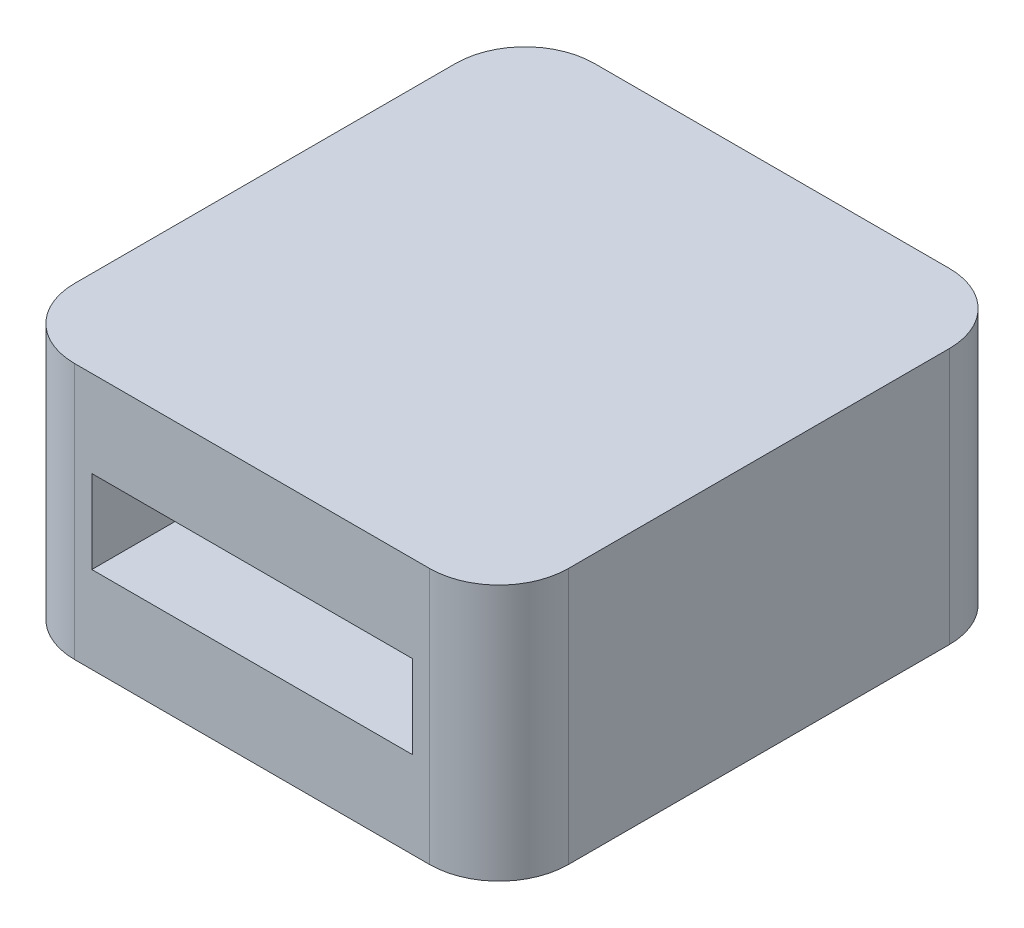
ISO-10303-21;
HEADER;
FILE_DESCRIPTION(('STEP AP214'),'2;1');
FILE_NAME('part.step','',(''),(''),'','','');
FILE_SCHEMA(('AUTOMOTIVE_DESIGN { 1 0 10303 214 1 1 1 1 }'));
ENDSEC;
DATA;
#1=APPLICATION_CONTEXT('core data for automotive mechanical design processes');
#2=APPLICATION_PROTOCOL_DEFINITION('international standard','automotive_design',2000,#1);
#3=PRODUCT_CONTEXT('',#1,'mechanical');
#4=PRODUCT('Part','Part','',(#3));
#5=PRODUCT_RELATED_PRODUCT_CATEGORY('part','',(#4));
#6=PRODUCT_DEFINITION_FORMATION('','',#4);
#7=PRODUCT_DEFINITION_CONTEXT('part definition',#1,'design');
#8=PRODUCT_DEFINITION('design','',#6,#7);
#9=PRODUCT_DEFINITION_SHAPE('','',#8);
#10=(LENGTH_UNIT() NAMED_UNIT(*) SI_UNIT(.MILLI.,.METRE.));
#11=(NAMED_UNIT(*) PLANE_ANGLE_UNIT() SI_UNIT($,.RADIAN.));
#12=(NAMED_UNIT(*) SI_UNIT($,.STERADIAN.) SOLID_ANGLE_UNIT());
#13=UNCERTAINTY_MEASURE_WITH_UNIT(LENGTH_MEASURE(1.E-05),#10,'distance_accuracy_value','');
#14=(GEOMETRIC_REPRESENTATION_CONTEXT(3) GLOBAL_UNCERTAINTY_ASSIGNED_CONTEXT((#13)) GLOBAL_UNIT_ASSIGNED_CONTEXT((#10,
#11,#12)) REPRESENTATION_CONTEXT('',''));
#15=CARTESIAN_POINT('',(0.,0.,0.));
#16=DIRECTION('',(0.,0.,1.));
#17=DIRECTION('',(1.,0.,0.));
#18=AXIS2_PLACEMENT_3D('',#15,#16,#17);
#19=CARTESIAN_POINT('',(0.,0.,15.));
#20=DIRECTION('',(0.,0.,-1.));
#21=DIRECTION('',(-1.,0.,0.));
#22=AXIS2_PLACEMENT_3D('',#19,#20,#21);
#23=PLANE('',#22);
#24=DIRECTION('',(1.,0.,0.));
#25=VECTOR('',#24,1.);
#26=CARTESIAN_POINT('',(-7.125,-3.7,15.));
#27=LINE('',#26,#25);
#28=CARTESIAN_POINT('',(-5.125,-3.7,15.));
#29=VERTEX_POINT('',#28);
#30=CARTESIAN_POINT('',(5.125,-3.7,15.));
#31=VERTEX_POINT('',#30);
#32=EDGE_CURVE('E191',#29,#31,#27,.T.);
#33=ORIENTED_EDGE('',*,*,#32,.T.);
#34=DIRECTION('',(0.,1.,0.));
#35=VECTOR('',#34,1.);
#36=CARTESIAN_POINT('',(5.125,0.,15.));
#37=LINE('',#36,#35);
#38=CARTESIAN_POINT('',(5.125,3.7,15.));
#39=VERTEX_POINT('',#38);
#40=EDGE_CURVE('E11',#31,#39,#37,.T.);
#41=ORIENTED_EDGE('',*,*,#40,.T.);
#42=DIRECTION('',(-1.,0.,0.));
#43=VECTOR('',#42,1.);
#44=CARTESIAN_POINT('',(-7.125,3.7,15.));
#45=LINE('',#44,#43);
#46=CARTESIAN_POINT('',(-5.125,3.7,15.));
#47=VERTEX_POINT('',#46);
#48=EDGE_CURVE('E187',#39,#47,#45,.T.);
#49=ORIENTED_EDGE('',*,*,#48,.T.);
#50=DIRECTION('',(0.,-1.,0.));
#51=VECTOR('',#50,1.);
#52=CARTESIAN_POINT('',(-5.125,0.,15.));
#53=LINE('',#52,#51);
#54=EDGE_CURVE('E49',#47,#29,#53,.T.);
#55=ORIENTED_EDGE('',*,*,#54,.T.);
#56=EDGE_LOOP('',(#33,#41,#49,#55));
#57=FACE_BOUND('',#56,.T.);
#58=DIRECTION('',(0.,1.,0.));
#59=VECTOR('',#58,1.);
#60=CARTESIAN_POINT('',(4.625,-1.2,15.));
#61=LINE('',#60,#59);
#62=CARTESIAN_POINT('',(4.625,-1.2,15.));
#63=VERTEX_POINT('',#62);
#64=CARTESIAN_POINT('',(4.625,1.2,15.));
#65=VERTEX_POINT('',#64);
#66=EDGE_CURVE('E133',#63,#65,#61,.T.);
#67=ORIENTED_EDGE('',*,*,#66,.F.);
#68=DIRECTION('',(1.,0.,0.));
#69=VECTOR('',#68,1.);
#70=CARTESIAN_POINT('',(-4.625,-1.2,15.));
#71=LINE('',#70,#69);
#72=CARTESIAN_POINT('',(-4.625,-1.2,15.));
#73=VERTEX_POINT('',#72);
#74=EDGE_CURVE('E163',#73,#63,#71,.T.);
#75=ORIENTED_EDGE('',*,*,#74,.F.);
#76=DIRECTION('',(0.,-1.,0.));
#77=VECTOR('',#76,1.);
#78=CARTESIAN_POINT('',(-4.625,-1.2,15.));
#79=LINE('',#78,#77);
#80=CARTESIAN_POINT('',(-4.625,1.2,15.));
#81=VERTEX_POINT('',#80);
#82=EDGE_CURVE('E158',#81,#73,#79,.T.);
#83=ORIENTED_EDGE('',*,*,#82,.F.);
#84=DIRECTION('',(-1.,0.,0.));
#85=VECTOR('',#84,1.);
#86=CARTESIAN_POINT('',(-4.625,1.2,15.));
#87=LINE('',#86,#85);
#88=EDGE_CURVE('E144',#65,#81,#87,.T.);
#89=ORIENTED_EDGE('',*,*,#88,.F.);
#90=EDGE_LOOP('',(#67,#75,#83,#89));
#91=FACE_BOUND('',#90,.T.);
#92=ADVANCED_FACE('F40',(#57,#91),#23,.F.);
#93=CARTESIAN_POINT('',(0.,0.,0.));
#94=DIRECTION('',(0.,0.,-1.));
#95=DIRECTION('',(-1.,0.,0.));
#96=AXIS2_PLACEMENT_3D('',#93,#94,#95);
#97=PLANE('',#96);
#98=DIRECTION('',(1.,0.,0.));
#99=VECTOR('',#98,1.);
#100=CARTESIAN_POINT('',(-7.125,-3.7,0.));
#101=LINE('',#100,#99);
#102=CARTESIAN_POINT('',(-5.125,-3.7,0.));
#103=VERTEX_POINT('',#102);
#104=CARTESIAN_POINT('',(5.125,-3.7,0.));
#105=VERTEX_POINT('',#104);
#106=EDGE_CURVE('E192',#103,#105,#101,.T.);
#107=ORIENTED_EDGE('',*,*,#106,.F.);
#108=DIRECTION('',(0.,-1.,0.));
#109=VECTOR('',#108,1.);
#110=CARTESIAN_POINT('',(-5.125,3.7,0.));
#111=LINE('',#110,#109);
#112=CARTESIAN_POINT('',(-5.125,3.7,0.));
#113=VERTEX_POINT('',#112);
#114=EDGE_CURVE('E239',#103,#113,#111,.F.);
#115=ORIENTED_EDGE('',*,*,#114,.T.);
#116=DIRECTION('',(-1.,0.,0.));
#117=VECTOR('',#116,1.);
#118=CARTESIAN_POINT('',(-7.125,3.7,0.));
#119=LINE('',#118,#117);
#120=CARTESIAN_POINT('',(5.125,3.7,0.));
#121=VERTEX_POINT('',#120);
#122=EDGE_CURVE('E153',#121,#113,#119,.T.);
#123=ORIENTED_EDGE('',*,*,#122,.F.);
#124=DIRECTION('',(0.,1.,0.));
#125=VECTOR('',#124,1.);
#126=CARTESIAN_POINT('',(5.125,-3.7,0.));
#127=LINE('',#126,#125);
#128=EDGE_CURVE('E236',#121,#105,#127,.F.);
#129=ORIENTED_EDGE('',*,*,#128,.T.);
#130=EDGE_LOOP('',(#107,#115,#123,#129));
#131=FACE_BOUND('',#130,.T.);
#132=DIRECTION('',(1.,0.,0.));
#133=VECTOR('',#132,1.);
#134=CARTESIAN_POINT('',(-4.625,-1.2,0.));
#135=LINE('',#134,#133);
#136=CARTESIAN_POINT('',(-4.625,-1.2,0.));
#137=VERTEX_POINT('',#136);
#138=CARTESIAN_POINT('',(4.625,-1.2,0.));
#139=VERTEX_POINT('',#138);
#140=EDGE_CURVE('E145',#137,#139,#135,.T.);
#141=ORIENTED_EDGE('',*,*,#140,.T.);
#142=DIRECTION('',(0.,1.,0.));
#143=VECTOR('',#142,1.);
#144=CARTESIAN_POINT('',(4.625,-1.2,0.));
#145=LINE('',#144,#143);
#146=CARTESIAN_POINT('',(4.625,1.2,0.));
#147=VERTEX_POINT('',#146);
#148=EDGE_CURVE('E168',#139,#147,#145,.T.);
#149=ORIENTED_EDGE('',*,*,#148,.T.);
#150=DIRECTION('',(-1.,0.,0.));
#151=VECTOR('',#150,1.);
#152=CARTESIAN_POINT('',(-4.625,1.2,0.));
#153=LINE('',#152,#151);
#154=CARTESIAN_POINT('',(-4.625,1.2,0.));
#155=VERTEX_POINT('',#154);
#156=EDGE_CURVE('E151',#147,#155,#153,.T.);
#157=ORIENTED_EDGE('',*,*,#156,.T.);
#158=DIRECTION('',(0.,-1.,0.));
#159=VECTOR('',#158,1.);
#160=CARTESIAN_POINT('',(-4.625,-1.2,0.));
#161=LINE('',#160,#159);
#162=EDGE_CURVE('E173',#155,#137,#161,.T.);
#163=ORIENTED_EDGE('',*,*,#162,.T.);
#164=EDGE_LOOP('',(#141,#149,#157,#163));
#165=FACE_BOUND('',#164,.T.);
#166=ADVANCED_FACE('F285',(#131,#165),#97,.T.);
#167=CARTESIAN_POINT('',(7.125,-3.7,15.));
#168=DIRECTION('',(-1.,0.,0.));
#169=DIRECTION('',(0.,-1.,0.));
#170=AXIS2_PLACEMENT_3D('',#167,#168,#169);
#171=PLANE('',#170);
#172=DIRECTION('',(0.,0.,-1.));
#173=VECTOR('',#172,1.);
#174=CARTESIAN_POINT('',(7.125,-3.7,15.));
#175=LINE('',#174,#173);
#176=CARTESIAN_POINT('',(7.125,-3.7,13.));
#177=VERTEX_POINT('',#176);
#178=CARTESIAN_POINT('',(7.125,-3.7,2.));
#179=VERTEX_POINT('',#178);
#180=EDGE_CURVE('E196',#177,#179,#175,.T.);
#181=ORIENTED_EDGE('',*,*,#180,.T.);
#182=DIRECTION('',(0.,1.,0.));
#183=VECTOR('',#182,1.);
#184=CARTESIAN_POINT('',(7.125,3.7,2.));
#185=LINE('',#184,#183);
#186=CARTESIAN_POINT('',(7.125,3.7,2.));
#187=VERTEX_POINT('',#186);
#188=EDGE_CURVE('E255',#179,#187,#185,.T.);
#189=ORIENTED_EDGE('',*,*,#188,.T.);
#190=DIRECTION('',(0.,0.,-1.));
#191=VECTOR('',#190,1.);
#192=CARTESIAN_POINT('',(7.125,3.7,15.));
#193=LINE('',#192,#191);
#194=CARTESIAN_POINT('',(7.125,3.7,13.));
#195=VERTEX_POINT('',#194);
#196=EDGE_CURVE('E214',#195,#187,#193,.T.);
#197=ORIENTED_EDGE('',*,*,#196,.F.);
#198=DIRECTION('',(0.,1.,0.));
#199=VECTOR('',#198,1.);
#200=CARTESIAN_POINT('',(7.125,-3.7,13.));
#201=LINE('',#200,#199);
#202=EDGE_CURVE('E252',#195,#177,#201,.F.);
#203=ORIENTED_EDGE('',*,*,#202,.T.);
#204=EDGE_LOOP('',(#181,#189,#197,#203));
#205=FACE_BOUND('',#204,.T.);
#206=ADVANCED_FACE('F292',(#205),#171,.F.);
#207=CARTESIAN_POINT('',(-7.125,3.7,15.));
#208=DIRECTION('',(0.,-1.,0.));
#209=DIRECTION('',(0.,0.,-1.));
#210=AXIS2_PLACEMENT_3D('',#207,#208,#209);
#211=PLANE('',#210);
#212=ORIENTED_EDGE('',*,*,#122,.T.);
#213=CARTESIAN_POINT('',(-5.125,3.7,2.));
#214=DIRECTION('',(0.,-1.,0.));
#215=DIRECTION('',(0.,0.,-1.));
#216=AXIS2_PLACEMENT_3D('',#213,#214,#215);
#217=CIRCLE('',#216,2.);
#218=CARTESIAN_POINT('',(-7.125,3.7,2.));
#219=VERTEX_POINT('',#218);
#220=EDGE_CURVE('E249',#113,#219,#217,.F.);
#221=ORIENTED_EDGE('',*,*,#220,.T.);
#222=DIRECTION('',(0.,0.,-1.));
#223=VECTOR('',#222,1.);
#224=CARTESIAN_POINT('',(-7.125,3.7,15.));
#225=LINE('',#224,#223);
#226=CARTESIAN_POINT('',(-7.125,3.7,13.));
#227=VERTEX_POINT('',#226);
#228=EDGE_CURVE('E210',#227,#219,#225,.T.);
#229=ORIENTED_EDGE('',*,*,#228,.F.);
#230=CARTESIAN_POINT('',(-5.125,3.7,13.));
#231=DIRECTION('',(0.,-1.,0.));
#232=DIRECTION('',(0.,0.,-1.));
#233=AXIS2_PLACEMENT_3D('',#230,#231,#232);
#234=CIRCLE('',#233,2.);
#235=EDGE_CURVE('E242',#227,#47,#234,.F.);
#236=ORIENTED_EDGE('',*,*,#235,.T.);
#237=ORIENTED_EDGE('',*,*,#48,.F.);
#238=CARTESIAN_POINT('',(5.125,3.7,13.));
#239=DIRECTION('',(0.,-1.,0.));
#240=DIRECTION('',(0.,0.,-1.));
#241=AXIS2_PLACEMENT_3D('',#238,#239,#240);
#242=CIRCLE('',#241,2.);
#243=EDGE_CURVE('E64',#39,#195,#242,.F.);
#244=ORIENTED_EDGE('',*,*,#243,.T.);
#245=ORIENTED_EDGE('',*,*,#196,.T.);
#246=CARTESIAN_POINT('',(5.125,3.7,2.));
#247=DIRECTION('',(0.,-1.,0.));
#248=DIRECTION('',(0.,0.,-1.));
#249=AXIS2_PLACEMENT_3D('',#246,#247,#248);
#250=CIRCLE('',#249,2.);
#251=EDGE_CURVE('E56',#187,#121,#250,.F.);
#252=ORIENTED_EDGE('',*,*,#251,.T.);
#253=EDGE_LOOP('',(#212,#221,#229,#236,#237,#244,#245,#252));
#254=FACE_BOUND('',#253,.T.);
#255=ADVANCED_FACE('F274',(#254),#211,.F.);
#256=CARTESIAN_POINT('',(-7.125,-3.7,15.));
#257=DIRECTION('',(1.,0.,0.));
#258=DIRECTION('',(0.,1.,0.));
#259=AXIS2_PLACEMENT_3D('',#256,#257,#258);
#260=PLANE('',#259);
#261=ORIENTED_EDGE('',*,*,#228,.T.);
#262=DIRECTION('',(0.,-1.,0.));
#263=VECTOR('',#262,1.);
#264=CARTESIAN_POINT('',(-7.125,-3.7,2.));
#265=LINE('',#264,#263);
#266=CARTESIAN_POINT('',(-7.125,-3.7,2.));
#267=VERTEX_POINT('',#266);
#268=EDGE_CURVE('E220',#219,#267,#265,.T.);
#269=ORIENTED_EDGE('',*,*,#268,.T.);
#270=DIRECTION('',(0.,0.,-1.));
#271=VECTOR('',#270,1.);
#272=CARTESIAN_POINT('',(-7.125,-3.7,15.));
#273=LINE('',#272,#271);
#274=CARTESIAN_POINT('',(-7.125,-3.7,13.));
#275=VERTEX_POINT('',#274);
#276=EDGE_CURVE('E206',#275,#267,#273,.T.);
#277=ORIENTED_EDGE('',*,*,#276,.F.);
#278=DIRECTION('',(0.,-1.,0.));
#279=VECTOR('',#278,1.);
#280=CARTESIAN_POINT('',(-7.125,-3.7,13.));
#281=LINE('',#280,#279);
#282=EDGE_CURVE('E217',#275,#227,#281,.F.);
#283=ORIENTED_EDGE('',*,*,#282,.T.);
#284=EDGE_LOOP('',(#261,#269,#277,#283));
#285=FACE_BOUND('',#284,.T.);
#286=ADVANCED_FACE('F278',(#285),#260,.F.);
#287=CARTESIAN_POINT('',(-7.125,-3.7,15.));
#288=DIRECTION('',(0.,1.,0.));
#289=DIRECTION('',(0.,0.,1.));
#290=AXIS2_PLACEMENT_3D('',#287,#288,#289);
#291=PLANE('',#290);
#292=ORIENTED_EDGE('',*,*,#276,.T.);
#293=CARTESIAN_POINT('',(-5.125,-3.7,2.));
#294=DIRECTION('',(0.,1.,0.));
#295=DIRECTION('',(0.,0.,1.));
#296=AXIS2_PLACEMENT_3D('',#293,#294,#295);
#297=CIRCLE('',#296,2.);
#298=EDGE_CURVE('E233',#267,#103,#297,.F.);
#299=ORIENTED_EDGE('',*,*,#298,.T.);
#300=ORIENTED_EDGE('',*,*,#106,.T.);
#301=CARTESIAN_POINT('',(5.125,-3.7,2.));
#302=DIRECTION('',(0.,1.,0.));
#303=DIRECTION('',(0.,0.,1.));
#304=AXIS2_PLACEMENT_3D('',#301,#302,#303);
#305=CIRCLE('',#304,2.);
#306=EDGE_CURVE('E230',#105,#179,#305,.F.);
#307=ORIENTED_EDGE('',*,*,#306,.T.);
#308=ORIENTED_EDGE('',*,*,#180,.F.);
#309=CARTESIAN_POINT('',(5.125,-3.7,13.));
#310=DIRECTION('',(0.,1.,0.));
#311=DIRECTION('',(0.,0.,1.));
#312=AXIS2_PLACEMENT_3D('',#309,#310,#311);
#313=CIRCLE('',#312,2.);
#314=EDGE_CURVE('E227',#177,#31,#313,.F.);
#315=ORIENTED_EDGE('',*,*,#314,.T.);
#316=ORIENTED_EDGE('',*,*,#32,.F.);
#317=CARTESIAN_POINT('',(-5.125,-3.7,13.));
#318=DIRECTION('',(0.,1.,0.));
#319=DIRECTION('',(0.,0.,1.));
#320=AXIS2_PLACEMENT_3D('',#317,#318,#319);
#321=CIRCLE('',#320,2.);
#322=EDGE_CURVE('E224',#29,#275,#321,.F.);
#323=ORIENTED_EDGE('',*,*,#322,.T.);
#324=EDGE_LOOP('',(#292,#299,#300,#307,#308,#315,#316,#323));
#325=FACE_BOUND('',#324,.T.);
#326=ADVANCED_FACE('F267',(#325),#291,.F.);
#327=CARTESIAN_POINT('',(4.625,-1.2,15.));
#328=DIRECTION('',(-1.,0.,0.));
#329=DIRECTION('',(0.,-1.,0.));
#330=AXIS2_PLACEMENT_3D('',#327,#328,#329);
#331=PLANE('',#330);
#332=ORIENTED_EDGE('',*,*,#148,.F.);
#333=DIRECTION('',(0.,0.,-1.));
#334=VECTOR('',#333,1.);
#335=CARTESIAN_POINT('',(4.625,-1.2,15.));
#336=LINE('',#335,#334);
#337=EDGE_CURVE('E139',#63,#139,#336,.T.);
#338=ORIENTED_EDGE('',*,*,#337,.F.);
#339=ORIENTED_EDGE('',*,*,#66,.T.);
#340=DIRECTION('',(0.,0.,-1.));
#341=VECTOR('',#340,1.);
#342=CARTESIAN_POINT('',(4.625,1.2,15.));
#343=LINE('',#342,#341);
#344=EDGE_CURVE('E136',#65,#147,#343,.T.);
#345=ORIENTED_EDGE('',*,*,#344,.T.);
#346=EDGE_LOOP('',(#332,#338,#339,#345));
#347=FACE_BOUND('',#346,.T.);
#348=ADVANCED_FACE('F135',(#347),#331,.T.);
#349=CARTESIAN_POINT('',(-4.625,1.2,15.));
#350=DIRECTION('',(0.,-1.,0.));
#351=DIRECTION('',(0.,0.,-1.));
#352=AXIS2_PLACEMENT_3D('',#349,#350,#351);
#353=PLANE('',#352);
#354=ORIENTED_EDGE('',*,*,#156,.F.);
#355=ORIENTED_EDGE('',*,*,#344,.F.);
#356=ORIENTED_EDGE('',*,*,#88,.T.);
#357=DIRECTION('',(0.,0.,-1.));
#358=VECTOR('',#357,1.);
#359=CARTESIAN_POINT('',(-4.625,1.2,15.));
#360=LINE('',#359,#358);
#361=EDGE_CURVE('E154',#81,#155,#360,.T.);
#362=ORIENTED_EDGE('',*,*,#361,.T.);
#363=EDGE_LOOP('',(#354,#355,#356,#362));
#364=FACE_BOUND('',#363,.T.);
#365=ADVANCED_FACE('F148',(#364),#353,.T.);
#366=CARTESIAN_POINT('',(-4.625,-1.2,15.));
#367=DIRECTION('',(1.,0.,0.));
#368=DIRECTION('',(0.,1.,0.));
#369=AXIS2_PLACEMENT_3D('',#366,#367,#368);
#370=PLANE('',#369);
#371=ORIENTED_EDGE('',*,*,#162,.F.);
#372=ORIENTED_EDGE('',*,*,#361,.F.);
#373=ORIENTED_EDGE('',*,*,#82,.T.);
#374=DIRECTION('',(0.,0.,-1.));
#375=VECTOR('',#374,1.);
#376=CARTESIAN_POINT('',(-4.625,-1.2,15.));
#377=LINE('',#376,#375);
#378=EDGE_CURVE('E182',#73,#137,#377,.T.);
#379=ORIENTED_EDGE('',*,*,#378,.T.);
#380=EDGE_LOOP('',(#371,#372,#373,#379));
#381=FACE_BOUND('',#380,.T.);
#382=ADVANCED_FACE('F331',(#381),#370,.T.);
#383=CARTESIAN_POINT('',(-4.625,-1.2,15.));
#384=DIRECTION('',(0.,1.,0.));
#385=DIRECTION('',(0.,0.,1.));
#386=AXIS2_PLACEMENT_3D('',#383,#384,#385);
#387=PLANE('',#386);
#388=ORIENTED_EDGE('',*,*,#140,.F.);
#389=ORIENTED_EDGE('',*,*,#378,.F.);
#390=ORIENTED_EDGE('',*,*,#74,.T.);
#391=ORIENTED_EDGE('',*,*,#337,.T.);
#392=EDGE_LOOP('',(#388,#389,#390,#391));
#393=FACE_BOUND('',#392,.T.);
#394=ADVANCED_FACE('F337',(#393),#387,.T.);
#395=CARTESIAN_POINT('',(-5.125,-3.7,2.));
#396=DIRECTION('',(0.,1.,0.));
#397=DIRECTION('',(-1.,0.,0.));
#398=AXIS2_PLACEMENT_3D('',#395,#396,#397);
#399=CYLINDRICAL_SURFACE('',#398,2.);
#400=ORIENTED_EDGE('',*,*,#220,.F.);
#401=ORIENTED_EDGE('',*,*,#114,.F.);
#402=ORIENTED_EDGE('',*,*,#298,.F.);
#403=ORIENTED_EDGE('',*,*,#268,.F.);
#404=EDGE_LOOP('',(#400,#401,#402,#403));
#405=FACE_BOUND('',#404,.T.);
#406=ADVANCED_FACE('F289',(#405),#399,.T.);
#407=CARTESIAN_POINT('',(5.125,-3.7,2.));
#408=DIRECTION('',(0.,-1.,0.));
#409=DIRECTION('',(1.,0.,0.));
#410=AXIS2_PLACEMENT_3D('',#407,#408,#409);
#411=CYLINDRICAL_SURFACE('',#410,2.);
#412=ORIENTED_EDGE('',*,*,#306,.F.);
#413=ORIENTED_EDGE('',*,*,#128,.F.);
#414=ORIENTED_EDGE('',*,*,#251,.F.);
#415=ORIENTED_EDGE('',*,*,#188,.F.);
#416=EDGE_LOOP('',(#412,#413,#414,#415));
#417=FACE_BOUND('',#416,.T.);
#418=ADVANCED_FACE('F290',(#417),#411,.T.);
#419=CARTESIAN_POINT('',(5.125,0.,13.));
#420=DIRECTION('',(0.,1.,0.));
#421=DIRECTION('',(-1.,0.,0.));
#422=AXIS2_PLACEMENT_3D('',#419,#420,#421);
#423=CYLINDRICAL_SURFACE('',#422,2.);
#424=ORIENTED_EDGE('',*,*,#314,.F.);
#425=ORIENTED_EDGE('',*,*,#202,.F.);
#426=ORIENTED_EDGE('',*,*,#243,.F.);
#427=ORIENTED_EDGE('',*,*,#40,.F.);
#428=EDGE_LOOP('',(#424,#425,#426,#427));
#429=FACE_BOUND('',#428,.T.);
#430=ADVANCED_FACE('F273',(#429),#423,.T.);
#431=CARTESIAN_POINT('',(-5.125,0.,13.));
#432=DIRECTION('',(0.,-1.,0.));
#433=DIRECTION('',(1.,0.,0.));
#434=AXIS2_PLACEMENT_3D('',#431,#432,#433);
#435=CYLINDRICAL_SURFACE('',#434,2.);
#436=ORIENTED_EDGE('',*,*,#235,.F.);
#437=ORIENTED_EDGE('',*,*,#282,.F.);
#438=ORIENTED_EDGE('',*,*,#322,.F.);
#439=ORIENTED_EDGE('',*,*,#54,.F.);
#440=EDGE_LOOP('',(#436,#437,#438,#439));
#441=FACE_BOUND('',#440,.T.);
#442=ADVANCED_FACE('F42',(#441),#435,.T.);
#443=CLOSED_SHELL('',(#92,#166,#206,#255,#286,#326,#348,#365,#382,#394,#406,#418,#430,#442));
#444=MANIFOLD_SOLID_BREP('B2',#443);
#445=ADVANCED_BREP_SHAPE_REPRESENTATION('',(#18,#444),#14);
#446=SHAPE_DEFINITION_REPRESENTATION(#9,#445);
ENDSEC;
END-ISO-10303-21;
